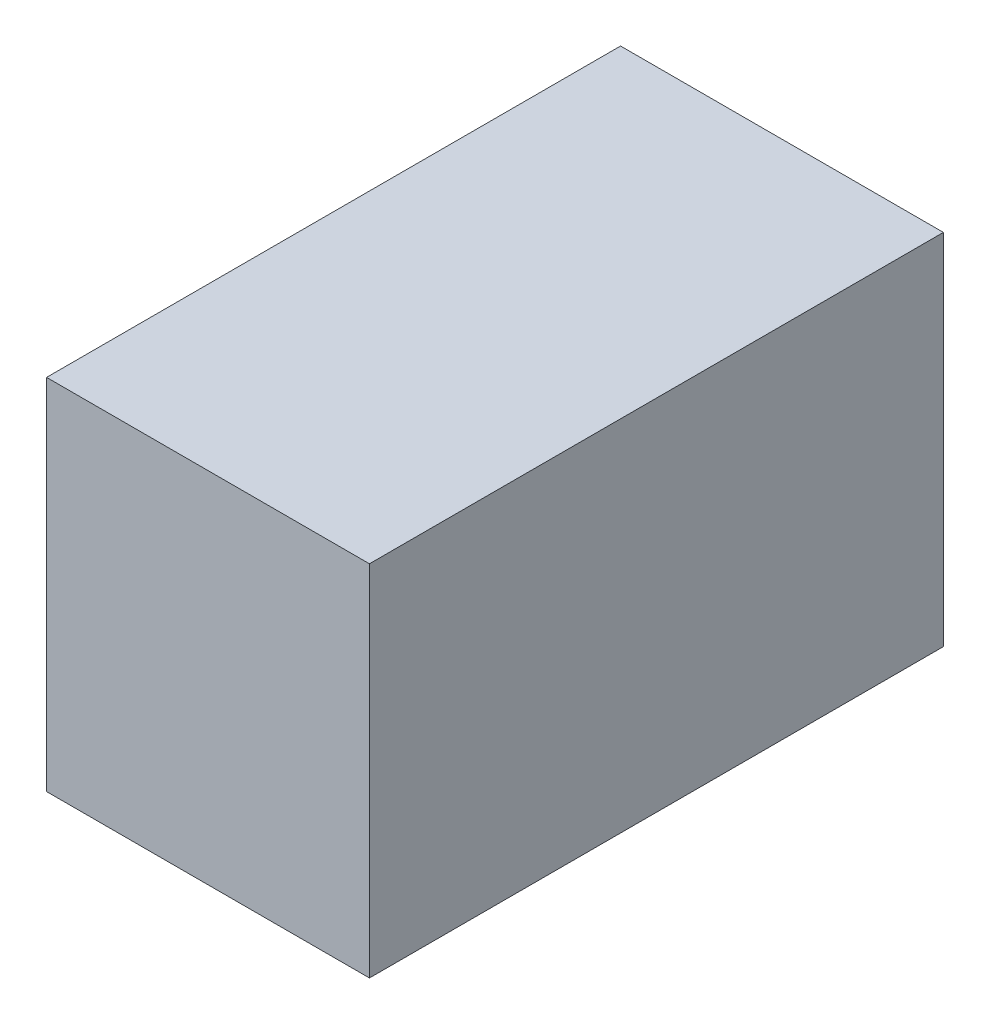
ISO-10303-21;
HEADER;
FILE_DESCRIPTION(('STEP AP214'),'2;1');
FILE_NAME('part.step','',(''),(''),'','','');
FILE_SCHEMA(('AUTOMOTIVE_DESIGN { 1 0 10303 214 1 1 1 1 }'));
ENDSEC;
DATA;
#1=APPLICATION_CONTEXT('core data for automotive mechanical design processes');
#2=APPLICATION_PROTOCOL_DEFINITION('international standard','automotive_design',2000,#1);
#3=PRODUCT_CONTEXT('',#1,'mechanical');
#4=PRODUCT('Part','Part','',(#3));
#5=PRODUCT_RELATED_PRODUCT_CATEGORY('part','',(#4));
#6=PRODUCT_DEFINITION_FORMATION('','',#4);
#7=PRODUCT_DEFINITION_CONTEXT('part definition',#1,'design');
#8=PRODUCT_DEFINITION('design','',#6,#7);
#9=PRODUCT_DEFINITION_SHAPE('','',#8);
#10=(LENGTH_UNIT() NAMED_UNIT(*) SI_UNIT(.MILLI.,.METRE.));
#11=(NAMED_UNIT(*) PLANE_ANGLE_UNIT() SI_UNIT($,.RADIAN.));
#12=(NAMED_UNIT(*) SI_UNIT($,.STERADIAN.) SOLID_ANGLE_UNIT());
#13=UNCERTAINTY_MEASURE_WITH_UNIT(LENGTH_MEASURE(1.E-05),#10,'distance_accuracy_value','');
#14=(GEOMETRIC_REPRESENTATION_CONTEXT(3) GLOBAL_UNCERTAINTY_ASSIGNED_CONTEXT((#13)) GLOBAL_UNIT_ASSIGNED_CONTEXT((#10,
#11,#12)) REPRESENTATION_CONTEXT('',''));
#15=CARTESIAN_POINT('',(0.,0.,0.));
#16=DIRECTION('',(0.,0.,1.));
#17=DIRECTION('',(1.,0.,0.));
#18=AXIS2_PLACEMENT_3D('',#15,#16,#17);
#19=CARTESIAN_POINT('',(0.,0.,80.));
#20=DIRECTION('',(1.,0.,0.));
#21=DIRECTION('',(0.,0.,-1.));
#22=AXIS2_PLACEMENT_3D('',#19,#20,#21);
#23=PLANE('',#22);
#24=DIRECTION('',(0.,-1.,0.));
#25=VECTOR('',#24,1.);
#26=CARTESIAN_POINT('',(0.,0.,0.));
#27=LINE('',#26,#25);
#28=CARTESIAN_POINT('',(0.,50.,0.));
#29=VERTEX_POINT('',#28);
#30=CARTESIAN_POINT('',(0.,0.,0.));
#31=VERTEX_POINT('',#30);
#32=EDGE_CURVE('E107',#29,#31,#27,.T.);
#33=ORIENTED_EDGE('',*,*,#32,.T.);
#34=DIRECTION('',(0.,0.,-1.));
#35=VECTOR('',#34,1.);
#36=CARTESIAN_POINT('',(0.,0.,80.));
#37=LINE('',#36,#35);
#38=CARTESIAN_POINT('',(0.,0.,80.));
#39=VERTEX_POINT('',#38);
#40=EDGE_CURVE('E11',#39,#31,#37,.T.);
#41=ORIENTED_EDGE('',*,*,#40,.F.);
#42=DIRECTION('',(0.,-1.,0.));
#43=VECTOR('',#42,1.);
#44=CARTESIAN_POINT('',(0.,0.,80.));
#45=LINE('',#44,#43);
#46=CARTESIAN_POINT('',(0.,50.,80.));
#47=VERTEX_POINT('',#46);
#48=EDGE_CURVE('E91',#47,#39,#45,.T.);
#49=ORIENTED_EDGE('',*,*,#48,.F.);
#50=DIRECTION('',(0.,0.,-1.));
#51=VECTOR('',#50,1.);
#52=CARTESIAN_POINT('',(0.,50.,80.));
#53=LINE('',#52,#51);
#54=EDGE_CURVE('E103',#47,#29,#53,.T.);
#55=ORIENTED_EDGE('',*,*,#54,.T.);
#56=EDGE_LOOP('',(#33,#41,#49,#55));
#57=FACE_BOUND('',#56,.T.);
#58=ADVANCED_FACE('F39',(#57),#23,.F.);
#59=CARTESIAN_POINT('',(0.,0.,80.));
#60=DIRECTION('',(0.,1.,0.));
#61=DIRECTION('',(0.,0.,1.));
#62=AXIS2_PLACEMENT_3D('',#59,#60,#61);
#63=PLANE('',#62);
#64=DIRECTION('',(1.,0.,0.));
#65=VECTOR('',#64,1.);
#66=CARTESIAN_POINT('',(0.,0.,0.));
#67=LINE('',#66,#65);
#68=CARTESIAN_POINT('',(45.,0.,0.));
#69=VERTEX_POINT('',#68);
#70=EDGE_CURVE('E96',#31,#69,#67,.T.);
#71=ORIENTED_EDGE('',*,*,#70,.T.);
#72=DIRECTION('',(0.,0.,-1.));
#73=VECTOR('',#72,1.);
#74=CARTESIAN_POINT('',(45.,0.,80.));
#75=LINE('',#74,#73);
#76=CARTESIAN_POINT('',(45.,0.,80.));
#77=VERTEX_POINT('',#76);
#78=EDGE_CURVE('E48',#77,#69,#75,.T.);
#79=ORIENTED_EDGE('',*,*,#78,.F.);
#80=DIRECTION('',(1.,0.,0.));
#81=VECTOR('',#80,1.);
#82=CARTESIAN_POINT('',(0.,0.,80.));
#83=LINE('',#82,#81);
#84=EDGE_CURVE('E86',#39,#77,#83,.T.);
#85=ORIENTED_EDGE('',*,*,#84,.F.);
#86=ORIENTED_EDGE('',*,*,#40,.T.);
#87=EDGE_LOOP('',(#71,#79,#85,#86));
#88=FACE_BOUND('',#87,.T.);
#89=ADVANCED_FACE('F95',(#88),#63,.F.);
#90=CARTESIAN_POINT('',(45.,0.,80.));
#91=DIRECTION('',(-1.,0.,0.));
#92=DIRECTION('',(0.,0.,1.));
#93=AXIS2_PLACEMENT_3D('',#90,#91,#92);
#94=PLANE('',#93);
#95=DIRECTION('',(0.,1.,0.));
#96=VECTOR('',#95,1.);
#97=CARTESIAN_POINT('',(45.,0.,0.));
#98=LINE('',#97,#96);
#99=CARTESIAN_POINT('',(45.,50.,0.));
#100=VERTEX_POINT('',#99);
#101=EDGE_CURVE('E73',#69,#100,#98,.T.);
#102=ORIENTED_EDGE('',*,*,#101,.T.);
#103=DIRECTION('',(0.,0.,-1.));
#104=VECTOR('',#103,1.);
#105=CARTESIAN_POINT('',(45.,50.,80.));
#106=LINE('',#105,#104);
#107=CARTESIAN_POINT('',(45.,50.,80.));
#108=VERTEX_POINT('',#107);
#109=EDGE_CURVE('E98',#108,#100,#106,.T.);
#110=ORIENTED_EDGE('',*,*,#109,.F.);
#111=DIRECTION('',(0.,1.,0.));
#112=VECTOR('',#111,1.);
#113=CARTESIAN_POINT('',(45.,0.,80.));
#114=LINE('',#113,#112);
#115=EDGE_CURVE('E89',#77,#108,#114,.T.);
#116=ORIENTED_EDGE('',*,*,#115,.F.);
#117=ORIENTED_EDGE('',*,*,#78,.T.);
#118=EDGE_LOOP('',(#102,#110,#116,#117));
#119=FACE_BOUND('',#118,.T.);
#120=ADVANCED_FACE('F99',(#119),#94,.F.);
#121=CARTESIAN_POINT('',(0.,50.,80.));
#122=DIRECTION('',(0.,-1.,0.));
#123=DIRECTION('',(0.,0.,-1.));
#124=AXIS2_PLACEMENT_3D('',#121,#122,#123);
#125=PLANE('',#124);
#126=DIRECTION('',(-1.,0.,0.));
#127=VECTOR('',#126,1.);
#128=CARTESIAN_POINT('',(0.,50.,0.));
#129=LINE('',#128,#127);
#130=EDGE_CURVE('E79',#100,#29,#129,.T.);
#131=ORIENTED_EDGE('',*,*,#130,.T.);
#132=ORIENTED_EDGE('',*,*,#54,.F.);
#133=DIRECTION('',(-1.,0.,0.));
#134=VECTOR('',#133,1.);
#135=CARTESIAN_POINT('',(0.,50.,80.));
#136=LINE('',#135,#134);
#137=EDGE_CURVE('E56',#108,#47,#136,.T.);
#138=ORIENTED_EDGE('',*,*,#137,.F.);
#139=ORIENTED_EDGE('',*,*,#109,.T.);
#140=EDGE_LOOP('',(#131,#132,#138,#139));
#141=FACE_BOUND('',#140,.T.);
#142=ADVANCED_FACE('F120',(#141),#125,.F.);
#143=CARTESIAN_POINT('',(0.,0.,80.));
#144=DIRECTION('',(0.,0.,-1.));
#145=DIRECTION('',(-1.,0.,0.));
#146=AXIS2_PLACEMENT_3D('',#143,#144,#145);
#147=PLANE('',#146);
#148=ORIENTED_EDGE('',*,*,#48,.T.);
#149=ORIENTED_EDGE('',*,*,#84,.T.);
#150=ORIENTED_EDGE('',*,*,#115,.T.);
#151=ORIENTED_EDGE('',*,*,#137,.T.);
#152=EDGE_LOOP('',(#148,#149,#150,#151));
#153=FACE_BOUND('',#152,.T.);
#154=ADVANCED_FACE('F87',(#153),#147,.F.);
#155=CARTESIAN_POINT('',(0.,0.,0.));
#156=DIRECTION('',(0.,0.,-1.));
#157=DIRECTION('',(-1.,0.,0.));
#158=AXIS2_PLACEMENT_3D('',#155,#156,#157);
#159=PLANE('',#158);
#160=ORIENTED_EDGE('',*,*,#32,.F.);
#161=ORIENTED_EDGE('',*,*,#130,.F.);
#162=ORIENTED_EDGE('',*,*,#101,.F.);
#163=ORIENTED_EDGE('',*,*,#70,.F.);
#164=EDGE_LOOP('',(#160,#161,#162,#163));
#165=FACE_BOUND('',#164,.T.);
#166=ADVANCED_FACE('F123',(#165),#159,.T.);
#167=CLOSED_SHELL('',(#58,#89,#120,#142,#154,#166));
#168=MANIFOLD_SOLID_BREP('B2',#167);
#169=ADVANCED_BREP_SHAPE_REPRESENTATION('',(#18,#168),#14);
#170=SHAPE_DEFINITION_REPRESENTATION(#9,#169);
ENDSEC;
END-ISO-10303-21;
